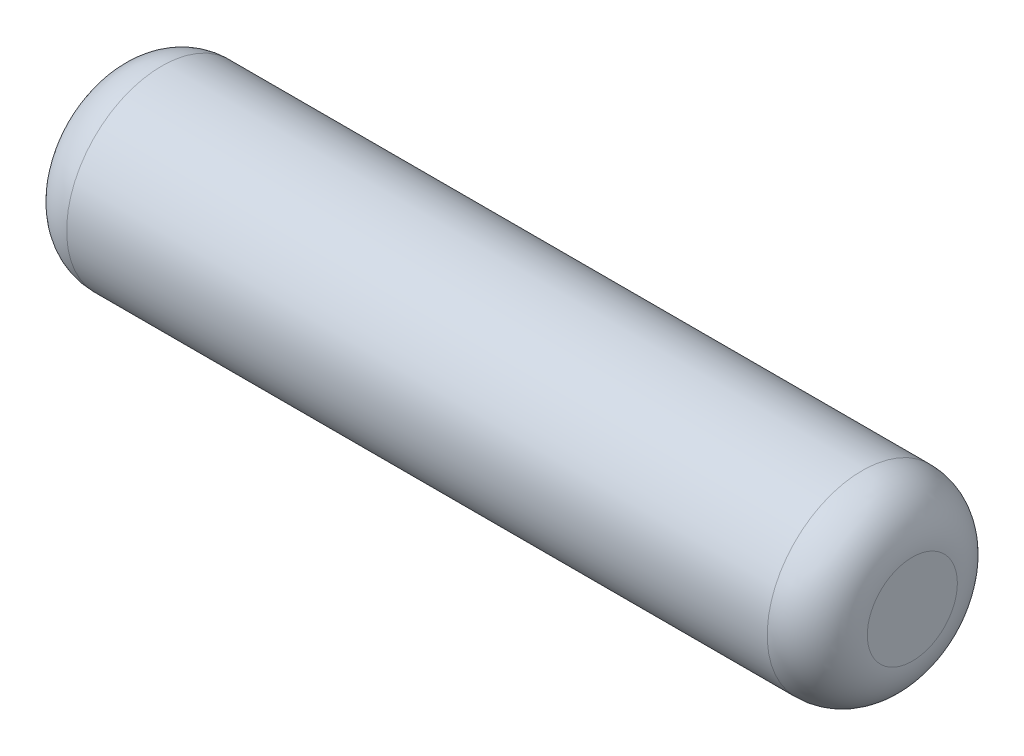
ISO-10303-21;
HEADER;
FILE_DESCRIPTION(('STEP AP214'),'2;1');
FILE_NAME('part.step','',(''),(''),'','','');
FILE_SCHEMA(('AUTOMOTIVE_DESIGN { 1 0 10303 214 1 1 1 1 }'));
ENDSEC;
DATA;
#1=APPLICATION_CONTEXT('core data for automotive mechanical design processes');
#2=APPLICATION_PROTOCOL_DEFINITION('international standard','automotive_design',2000,#1);
#3=PRODUCT_CONTEXT('',#1,'mechanical');
#4=PRODUCT('Part','Part','',(#3));
#5=PRODUCT_RELATED_PRODUCT_CATEGORY('part','',(#4));
#6=PRODUCT_DEFINITION_FORMATION('','',#4);
#7=PRODUCT_DEFINITION_CONTEXT('part definition',#1,'design');
#8=PRODUCT_DEFINITION('design','',#6,#7);
#9=PRODUCT_DEFINITION_SHAPE('','',#8);
#10=(LENGTH_UNIT() NAMED_UNIT(*) SI_UNIT(.MILLI.,.METRE.));
#11=(NAMED_UNIT(*) PLANE_ANGLE_UNIT() SI_UNIT($,.RADIAN.));
#12=(NAMED_UNIT(*) SI_UNIT($,.STERADIAN.) SOLID_ANGLE_UNIT());
#13=UNCERTAINTY_MEASURE_WITH_UNIT(LENGTH_MEASURE(1.E-05),#10,'distance_accuracy_value','');
#14=(GEOMETRIC_REPRESENTATION_CONTEXT(3) GLOBAL_UNCERTAINTY_ASSIGNED_CONTEXT((#13)) GLOBAL_UNIT_ASSIGNED_CONTEXT((#10,
#11,#12)) REPRESENTATION_CONTEXT('',''));
#15=CARTESIAN_POINT('',(0.,0.,0.));
#16=DIRECTION('',(0.,0.,1.));
#17=DIRECTION('',(1.,0.,0.));
#18=AXIS2_PLACEMENT_3D('',#15,#16,#17);
#19=CARTESIAN_POINT('',(406.4,0.,0.));
#20=DIRECTION('',(-1.,0.,0.));
#21=DIRECTION('',(0.,0.,1.));
#22=AXIS2_PLACEMENT_3D('',#19,#20,#21);
#23=CYLINDRICAL_SURFACE('',#22,48.26);
#24=CARTESIAN_POINT('',(381.,0.,0.));
#25=DIRECTION('',(1.,0.,0.));
#26=DIRECTION('',(0.,0.,-1.));
#27=AXIS2_PLACEMENT_3D('',#24,#25,#26);
#28=CIRCLE('',#27,48.26);
#29=CARTESIAN_POINT('',(381.,0.,-48.26));
#30=VERTEX_POINT('',#29);
#31=EDGE_CURVE('E45',#30,#30,#28,.F.);
#32=ORIENTED_EDGE('',*,*,#31,.T.);
#33=EDGE_LOOP('',(#32));
#34=FACE_BOUND('',#33,.T.);
#35=CARTESIAN_POINT('',(25.4,0.,0.));
#36=DIRECTION('',(1.,0.,0.));
#37=DIRECTION('',(0.,0.,-1.));
#38=AXIS2_PLACEMENT_3D('',#35,#36,#37);
#39=CIRCLE('',#38,48.26);
#40=CARTESIAN_POINT('',(25.4,0.,-48.26));
#41=VERTEX_POINT('',#40);
#42=EDGE_CURVE('E50',#41,#41,#39,.T.);
#43=ORIENTED_EDGE('',*,*,#42,.T.);
#44=EDGE_LOOP('',(#43));
#45=FACE_BOUND('',#44,.T.);
#46=ADVANCED_FACE('F37',(#34,#45),#23,.T.);
#47=CARTESIAN_POINT('',(406.4,0.,0.));
#48=DIRECTION('',(1.,0.,0.));
#49=DIRECTION('',(0.,0.,-1.));
#50=AXIS2_PLACEMENT_3D('',#47,#48,#49);
#51=PLANE('',#50);
#52=CARTESIAN_POINT('',(406.4,0.,0.));
#53=DIRECTION('',(1.,0.,0.));
#54=DIRECTION('',(0.,0.,-1.));
#55=AXIS2_PLACEMENT_3D('',#52,#53,#54);
#56=CIRCLE('',#55,22.86);
#57=CARTESIAN_POINT('',(406.4,0.,-22.86));
#58=VERTEX_POINT('',#57);
#59=EDGE_CURVE('E55',#58,#58,#56,.T.);
#60=ORIENTED_EDGE('',*,*,#59,.T.);
#61=EDGE_LOOP('',(#60));
#62=FACE_BOUND('',#61,.T.);
#63=ADVANCED_FACE('F62',(#62),#51,.T.);
#64=CARTESIAN_POINT('',(0.,0.,0.));
#65=DIRECTION('',(1.,0.,0.));
#66=DIRECTION('',(0.,0.,-1.));
#67=AXIS2_PLACEMENT_3D('',#64,#65,#66);
#68=PLANE('',#67);
#69=CARTESIAN_POINT('',(0.,0.,0.));
#70=DIRECTION('',(1.,0.,0.));
#71=DIRECTION('',(0.,0.,-1.));
#72=AXIS2_PLACEMENT_3D('',#69,#70,#71);
#73=CIRCLE('',#72,22.86);
#74=CARTESIAN_POINT('',(0.,0.,-22.86));
#75=VERTEX_POINT('',#74);
#76=EDGE_CURVE('E10',#75,#75,#73,.F.);
#77=ORIENTED_EDGE('',*,*,#76,.T.);
#78=EDGE_LOOP('',(#77));
#79=FACE_BOUND('',#78,.T.);
#80=ADVANCED_FACE('F66',(#79),#68,.F.);
#81=CARTESIAN_POINT('',(381.,0.,0.));
#82=DIRECTION('',(1.,0.,0.));
#83=DIRECTION('',(0.,0.,-1.));
#84=AXIS2_PLACEMENT_3D('',#81,#82,#83);
#85=DEGENERATE_TOROIDAL_SURFACE('',#84,22.86,25.4,.T.);
#86=ORIENTED_EDGE('',*,*,#31,.F.);
#87=EDGE_LOOP('',(#86));
#88=FACE_BOUND('',#87,.T.);
#89=ORIENTED_EDGE('',*,*,#59,.F.);
#90=EDGE_LOOP('',(#89));
#91=FACE_BOUND('',#90,.T.);
#92=ADVANCED_FACE('F64',(#88,#91),#85,.T.);
#93=CARTESIAN_POINT('',(25.4,0.,0.));
#94=DIRECTION('',(1.,0.,0.));
#95=DIRECTION('',(0.,0.,-1.));
#96=AXIS2_PLACEMENT_3D('',#93,#94,#95);
#97=DEGENERATE_TOROIDAL_SURFACE('',#96,22.86,25.4,.T.);
#98=ORIENTED_EDGE('',*,*,#76,.F.);
#99=EDGE_LOOP('',(#98));
#100=FACE_BOUND('',#99,.T.);
#101=ORIENTED_EDGE('',*,*,#42,.F.);
#102=EDGE_LOOP('',(#101));
#103=FACE_BOUND('',#102,.T.);
#104=ADVANCED_FACE('F39',(#100,#103),#97,.T.);
#105=CLOSED_SHELL('',(#46,#63,#80,#92,#104));
#106=MANIFOLD_SOLID_BREP('B2',#105);
#107=ADVANCED_BREP_SHAPE_REPRESENTATION('',(#18,#106),#14);
#108=SHAPE_DEFINITION_REPRESENTATION(#9,#107);
ENDSEC;
END-ISO-10303-21;
